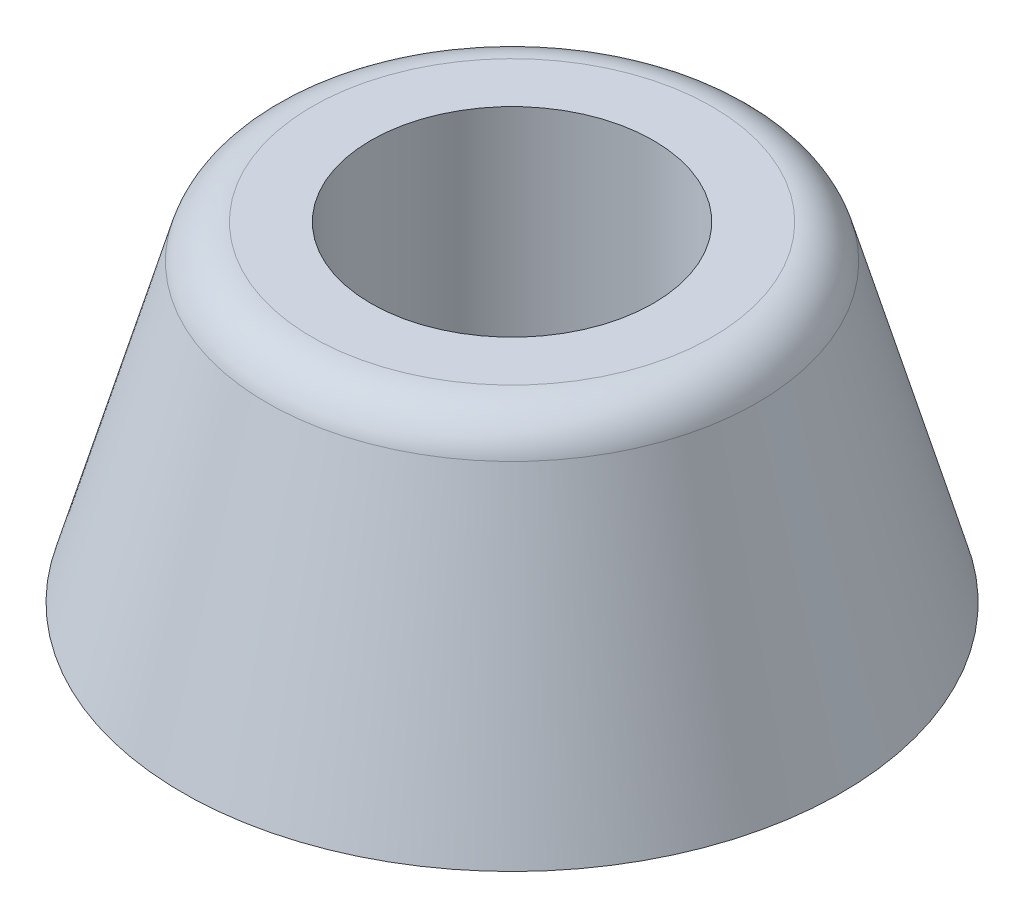
ISO-10303-21;
HEADER;
FILE_DESCRIPTION(('STEP AP214'),'2;1');
FILE_NAME('part.step','',(''),(''),'','','');
FILE_SCHEMA(('AUTOMOTIVE_DESIGN { 1 0 10303 214 1 1 1 1 }'));
ENDSEC;
DATA;
#1=APPLICATION_CONTEXT('core data for automotive mechanical design processes');
#2=APPLICATION_PROTOCOL_DEFINITION('international standard','automotive_design',2000,#1);
#3=PRODUCT_CONTEXT('',#1,'mechanical');
#4=PRODUCT('Part','Part','',(#3));
#5=PRODUCT_RELATED_PRODUCT_CATEGORY('part','',(#4));
#6=PRODUCT_DEFINITION_FORMATION('','',#4);
#7=PRODUCT_DEFINITION_CONTEXT('part definition',#1,'design');
#8=PRODUCT_DEFINITION('design','',#6,#7);
#9=PRODUCT_DEFINITION_SHAPE('','',#8);
#10=(LENGTH_UNIT() NAMED_UNIT(*) SI_UNIT(.MILLI.,.METRE.));
#11=(NAMED_UNIT(*) PLANE_ANGLE_UNIT() SI_UNIT($,.RADIAN.));
#12=(NAMED_UNIT(*) SI_UNIT($,.STERADIAN.) SOLID_ANGLE_UNIT());
#13=UNCERTAINTY_MEASURE_WITH_UNIT(LENGTH_MEASURE(1.E-05),#10,'distance_accuracy_value','');
#14=(GEOMETRIC_REPRESENTATION_CONTEXT(3) GLOBAL_UNCERTAINTY_ASSIGNED_CONTEXT((#13)) GLOBAL_UNIT_ASSIGNED_CONTEXT((#10,
#11,#12)) REPRESENTATION_CONTEXT('',''));
#15=CARTESIAN_POINT('',(0.,0.,0.));
#16=DIRECTION('',(0.,0.,1.));
#17=DIRECTION('',(1.,0.,0.));
#18=AXIS2_PLACEMENT_3D('',#15,#16,#17);
#19=CARTESIAN_POINT('',(0.,6.,0.));
#20=DIRECTION('',(0.,-1.,0.));
#21=DIRECTION('',(0.,0.,-1.));
#22=AXIS2_PLACEMENT_3D('',#19,#20,#21);
#23=TOROIDAL_SURFACE('',#22,4.24569858724564,1.);
#24=CARTESIAN_POINT('',(0.,6.27472112789737,0.));
#25=DIRECTION('',(0.,-1.,0.));
#26=DIRECTION('',(0.,0.,-1.));
#27=AXIS2_PLACEMENT_3D('',#24,#25,#26);
#28=CIRCLE('',#27,5.20722253488646);
#29=CARTESIAN_POINT('',(0.,6.27472112789737,-5.20722253488646));
#30=VERTEX_POINT('',#29);
#31=EDGE_CURVE('E10',#30,#30,#28,.T.);
#32=ORIENTED_EDGE('',*,*,#31,.F.);
#33=EDGE_LOOP('',(#32));
#34=FACE_BOUND('',#33,.T.);
#35=CARTESIAN_POINT('',(0.,7.,0.));
#36=DIRECTION('',(0.,-1.,0.));
#37=DIRECTION('',(0.,0.,-1.));
#38=AXIS2_PLACEMENT_3D('',#35,#36,#37);
#39=CIRCLE('',#38,4.24569858724564);
#40=CARTESIAN_POINT('',(0.,7.,-4.24569858724564));
#41=VERTEX_POINT('',#40);
#42=EDGE_CURVE('E74',#41,#41,#39,.T.);
#43=ORIENTED_EDGE('',*,*,#42,.T.);
#44=EDGE_LOOP('',(#43));
#45=FACE_BOUND('',#44,.T.);
#46=ADVANCED_FACE('F43',(#34,#45),#23,.T.);
#47=CARTESIAN_POINT('',(0.,6.27472112789737,0.));
#48=DIRECTION('',(0.,-1.,0.));
#49=DIRECTION('',(0.,0.,-1.));
#50=AXIS2_PLACEMENT_3D('',#47,#48,#49);
#51=CONICAL_SURFACE('',#50,5.20722253488646,0.278299659005111);
#52=CARTESIAN_POINT('',(0.,0.,0.));
#53=DIRECTION('',(0.,-1.,0.));
#54=DIRECTION('',(0.,0.,-1.));
#55=AXIS2_PLACEMENT_3D('',#52,#53,#54);
#56=CIRCLE('',#55,7.);
#57=CARTESIAN_POINT('',(0.,0.,-7.));
#58=VERTEX_POINT('',#57);
#59=EDGE_CURVE('E50',#58,#58,#56,.T.);
#60=ORIENTED_EDGE('',*,*,#59,.F.);
#61=EDGE_LOOP('',(#60));
#62=FACE_BOUND('',#61,.T.);
#63=ORIENTED_EDGE('',*,*,#31,.T.);
#64=EDGE_LOOP('',(#63));
#65=FACE_BOUND('',#64,.T.);
#66=ADVANCED_FACE('F106',(#62,#65),#51,.T.);
#67=CARTESIAN_POINT('',(-7.,0.,0.));
#68=DIRECTION('',(0.,1.,0.));
#69=DIRECTION('',(0.,0.,1.));
#70=AXIS2_PLACEMENT_3D('',#67,#68,#69);
#71=PLANE('',#70);
#72=CARTESIAN_POINT('',(0.,0.,0.));
#73=DIRECTION('',(0.,-1.,0.));
#74=DIRECTION('',(0.,0.,-1.));
#75=AXIS2_PLACEMENT_3D('',#72,#73,#74);
#76=CIRCLE('',#75,1.5);
#77=CARTESIAN_POINT('',(0.,0.,-1.5));
#78=VERTEX_POINT('',#77);
#79=EDGE_CURVE('E55',#78,#78,#76,.T.);
#80=ORIENTED_EDGE('',*,*,#79,.F.);
#81=EDGE_LOOP('',(#80));
#82=FACE_BOUND('',#81,.T.);
#83=ORIENTED_EDGE('',*,*,#59,.T.);
#84=EDGE_LOOP('',(#83));
#85=FACE_BOUND('',#84,.T.);
#86=ADVANCED_FACE('F101',(#82,#85),#71,.F.);
#87=CARTESIAN_POINT('',(0.,0.,0.));
#88=DIRECTION('',(0.,-1.,0.));
#89=DIRECTION('',(0.,0.,-1.));
#90=AXIS2_PLACEMENT_3D('',#87,#88,#89);
#91=CYLINDRICAL_SURFACE('',#90,1.5);
#92=CARTESIAN_POINT('',(0.,2.,0.));
#93=DIRECTION('',(0.,-1.,0.));
#94=DIRECTION('',(0.,0.,-1.));
#95=AXIS2_PLACEMENT_3D('',#92,#93,#94);
#96=CIRCLE('',#95,1.5);
#97=CARTESIAN_POINT('',(0.,2.,-1.5));
#98=VERTEX_POINT('',#97);
#99=EDGE_CURVE('E60',#98,#98,#96,.T.);
#100=ORIENTED_EDGE('',*,*,#99,.F.);
#101=EDGE_LOOP('',(#100));
#102=FACE_BOUND('',#101,.T.);
#103=ORIENTED_EDGE('',*,*,#79,.T.);
#104=EDGE_LOOP('',(#103));
#105=FACE_BOUND('',#104,.T.);
#106=ADVANCED_FACE('F95',(#102,#105),#91,.F.);
#107=CARTESIAN_POINT('',(-1.5,2.,0.));
#108=DIRECTION('',(0.,-1.,0.));
#109=DIRECTION('',(0.,0.,-1.));
#110=AXIS2_PLACEMENT_3D('',#107,#108,#109);
#111=PLANE('',#110);
#112=CARTESIAN_POINT('',(0.,2.,0.));
#113=DIRECTION('',(0.,-1.,0.));
#114=DIRECTION('',(0.,0.,-1.));
#115=AXIS2_PLACEMENT_3D('',#112,#113,#114);
#116=CIRCLE('',#115,3.);
#117=CARTESIAN_POINT('',(0.,2.,-3.));
#118=VERTEX_POINT('',#117);
#119=EDGE_CURVE('E66',#118,#118,#116,.T.);
#120=ORIENTED_EDGE('',*,*,#119,.F.);
#121=EDGE_LOOP('',(#120));
#122=FACE_BOUND('',#121,.T.);
#123=ORIENTED_EDGE('',*,*,#99,.T.);
#124=EDGE_LOOP('',(#123));
#125=FACE_BOUND('',#124,.T.);
#126=ADVANCED_FACE('F89',(#122,#125),#111,.F.);
#127=CARTESIAN_POINT('',(0.,0.,0.));
#128=DIRECTION('',(0.,-1.,0.));
#129=DIRECTION('',(0.,0.,-1.));
#130=AXIS2_PLACEMENT_3D('',#127,#128,#129);
#131=CYLINDRICAL_SURFACE('',#130,3.);
#132=CARTESIAN_POINT('',(0.,7.,0.));
#133=DIRECTION('',(0.,-1.,0.));
#134=DIRECTION('',(0.,0.,-1.));
#135=AXIS2_PLACEMENT_3D('',#132,#133,#134);
#136=CIRCLE('',#135,3.);
#137=CARTESIAN_POINT('',(0.,7.,-3.));
#138=VERTEX_POINT('',#137);
#139=EDGE_CURVE('E70',#138,#138,#136,.T.);
#140=ORIENTED_EDGE('',*,*,#139,.F.);
#141=EDGE_LOOP('',(#140));
#142=FACE_BOUND('',#141,.T.);
#143=ORIENTED_EDGE('',*,*,#119,.T.);
#144=EDGE_LOOP('',(#143));
#145=FACE_BOUND('',#144,.T.);
#146=ADVANCED_FACE('F83',(#142,#145),#131,.F.);
#147=CARTESIAN_POINT('',(-3.,7.,0.));
#148=DIRECTION('',(0.,-1.,0.));
#149=DIRECTION('',(0.,0.,-1.));
#150=AXIS2_PLACEMENT_3D('',#147,#148,#149);
#151=PLANE('',#150);
#152=ORIENTED_EDGE('',*,*,#42,.F.);
#153=EDGE_LOOP('',(#152));
#154=FACE_BOUND('',#153,.T.);
#155=ORIENTED_EDGE('',*,*,#139,.T.);
#156=EDGE_LOOP('',(#155));
#157=FACE_BOUND('',#156,.T.);
#158=ADVANCED_FACE('F80',(#154,#157),#151,.F.);
#159=CLOSED_SHELL('',(#46,#66,#86,#106,#126,#146,#158));
#160=MANIFOLD_SOLID_BREP('B2',#159);
#161=ADVANCED_BREP_SHAPE_REPRESENTATION('',(#18,#160),#14);
#162=SHAPE_DEFINITION_REPRESENTATION(#9,#161);
ENDSEC;
END-ISO-10303-21;
